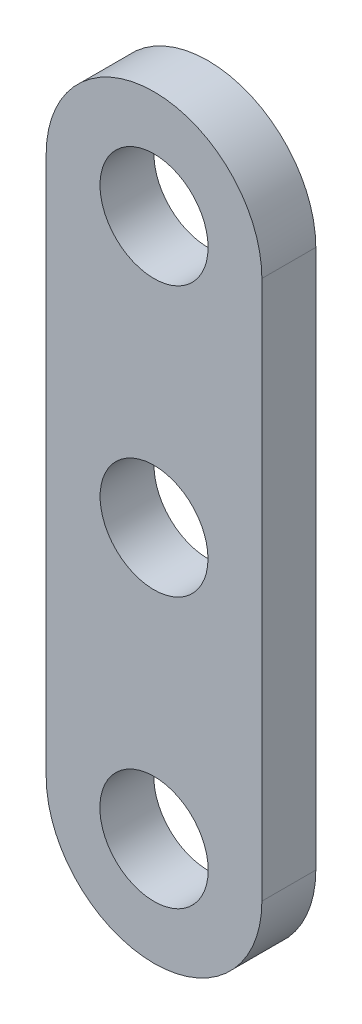
ISO-10303-21;
HEADER;
FILE_DESCRIPTION(('STEP AP214'),'2;1');
FILE_NAME('part.step','',(''),(''),'','','');
FILE_SCHEMA(('AUTOMOTIVE_DESIGN { 1 0 10303 214 1 1 1 1 }'));
ENDSEC;
DATA;
#1=APPLICATION_CONTEXT('core data for automotive mechanical design processes');
#2=APPLICATION_PROTOCOL_DEFINITION('international standard','automotive_design',2000,#1);
#3=PRODUCT_CONTEXT('',#1,'mechanical');
#4=PRODUCT('Part','Part','',(#3));
#5=PRODUCT_RELATED_PRODUCT_CATEGORY('part','',(#4));
#6=PRODUCT_DEFINITION_FORMATION('','',#4);
#7=PRODUCT_DEFINITION_CONTEXT('part definition',#1,'design');
#8=PRODUCT_DEFINITION('design','',#6,#7);
#9=PRODUCT_DEFINITION_SHAPE('','',#8);
#10=(LENGTH_UNIT() NAMED_UNIT(*) SI_UNIT(.MILLI.,.METRE.));
#11=(NAMED_UNIT(*) PLANE_ANGLE_UNIT() SI_UNIT($,.RADIAN.));
#12=(NAMED_UNIT(*) SI_UNIT($,.STERADIAN.) SOLID_ANGLE_UNIT());
#13=UNCERTAINTY_MEASURE_WITH_UNIT(LENGTH_MEASURE(1.E-05),#10,'distance_accuracy_value','');
#14=(GEOMETRIC_REPRESENTATION_CONTEXT(3) GLOBAL_UNCERTAINTY_ASSIGNED_CONTEXT((#13)) GLOBAL_UNIT_ASSIGNED_CONTEXT((#10,
#11,#12)) REPRESENTATION_CONTEXT('',''));
#15=CARTESIAN_POINT('',(0.,0.,0.));
#16=DIRECTION('',(0.,0.,1.));
#17=DIRECTION('',(1.,0.,0.));
#18=AXIS2_PLACEMENT_3D('',#15,#16,#17);
#19=CARTESIAN_POINT('',(0.,0.,3.));
#20=DIRECTION('',(0.,0.,1.));
#21=DIRECTION('',(1.,0.,0.));
#22=AXIS2_PLACEMENT_3D('',#19,#20,#21);
#23=PLANE('',#22);
#24=CARTESIAN_POINT('',(0.,-30.,3.));
#25=DIRECTION('',(0.,0.,1.));
#26=DIRECTION('',(1.,0.,0.));
#27=AXIS2_PLACEMENT_3D('',#24,#25,#26);
#28=CIRCLE('',#27,3.01397284489997);
#29=CARTESIAN_POINT('',(3.01397284489997,-30.,3.));
#30=VERTEX_POINT('',#29);
#31=EDGE_CURVE('E121',#30,#30,#28,.T.);
#32=ORIENTED_EDGE('',*,*,#31,.F.);
#33=EDGE_LOOP('',(#32));
#34=FACE_BOUND('',#33,.T.);
#35=CARTESIAN_POINT('',(0.,0.,3.));
#36=DIRECTION('',(0.,0.,1.));
#37=DIRECTION('',(1.,0.,0.));
#38=AXIS2_PLACEMENT_3D('',#35,#36,#37);
#39=CIRCLE('',#38,6.);
#40=CARTESIAN_POINT('',(6.,0.,3.));
#41=VERTEX_POINT('',#40);
#42=CARTESIAN_POINT('',(-6.,0.,3.));
#43=VERTEX_POINT('',#42);
#44=EDGE_CURVE('E91',#41,#43,#39,.T.);
#45=ORIENTED_EDGE('',*,*,#44,.T.);
#46=DIRECTION('',(0.,-1.,0.));
#47=VECTOR('',#46,1.);
#48=CARTESIAN_POINT('',(-6.,0.,3.));
#49=LINE('',#48,#47);
#50=CARTESIAN_POINT('',(-5.99999999999999,-30.,3.));
#51=VERTEX_POINT('',#50);
#52=EDGE_CURVE('E86',#43,#51,#49,.T.);
#53=ORIENTED_EDGE('',*,*,#52,.T.);
#54=CARTESIAN_POINT('',(0.,-30.,3.));
#55=DIRECTION('',(0.,0.,1.));
#56=DIRECTION('',(1.,0.,0.));
#57=AXIS2_PLACEMENT_3D('',#54,#55,#56);
#58=CIRCLE('',#57,6.);
#59=CARTESIAN_POINT('',(6.,-30.,3.));
#60=VERTEX_POINT('',#59);
#61=EDGE_CURVE('E89',#51,#60,#58,.T.);
#62=ORIENTED_EDGE('',*,*,#61,.T.);
#63=DIRECTION('',(0.,1.,0.));
#64=VECTOR('',#63,1.);
#65=CARTESIAN_POINT('',(6.,0.,3.));
#66=LINE('',#65,#64);
#67=EDGE_CURVE('E56',#60,#41,#66,.T.);
#68=ORIENTED_EDGE('',*,*,#67,.T.);
#69=EDGE_LOOP('',(#45,#53,#62,#68));
#70=FACE_BOUND('',#69,.T.);
#71=CARTESIAN_POINT('',(0.,0.,3.));
#72=DIRECTION('',(0.,0.,1.));
#73=DIRECTION('',(1.,0.,0.));
#74=AXIS2_PLACEMENT_3D('',#71,#72,#73);
#75=CIRCLE('',#74,3.00606813744803);
#76=CARTESIAN_POINT('',(3.00606813744803,0.,3.));
#77=VERTEX_POINT('',#76);
#78=EDGE_CURVE('E106',#77,#77,#75,.T.);
#79=ORIENTED_EDGE('',*,*,#78,.F.);
#80=EDGE_LOOP('',(#79));
#81=FACE_BOUND('',#80,.T.);
#82=CARTESIAN_POINT('',(0.,-15.,3.));
#83=DIRECTION('',(0.,0.,1.));
#84=DIRECTION('',(1.,0.,0.));
#85=AXIS2_PLACEMENT_3D('',#82,#83,#84);
#86=CIRCLE('',#85,3.00091393736871);
#87=CARTESIAN_POINT('',(3.00091393736871,-15.,3.));
#88=VERTEX_POINT('',#87);
#89=EDGE_CURVE('E127',#88,#88,#86,.T.);
#90=ORIENTED_EDGE('',*,*,#89,.F.);
#91=EDGE_LOOP('',(#90));
#92=FACE_BOUND('',#91,.T.);
#93=ADVANCED_FACE('F39',(#34,#70,#81,#92),#23,.T.);
#94=CARTESIAN_POINT('',(0.,0.,0.));
#95=DIRECTION('',(0.,0.,1.));
#96=DIRECTION('',(1.,0.,0.));
#97=AXIS2_PLACEMENT_3D('',#94,#95,#96);
#98=PLANE('',#97);
#99=CARTESIAN_POINT('',(0.,0.,0.));
#100=DIRECTION('',(0.,0.,1.));
#101=DIRECTION('',(1.,0.,0.));
#102=AXIS2_PLACEMENT_3D('',#99,#100,#101);
#103=CIRCLE('',#102,6.);
#104=CARTESIAN_POINT('',(6.,0.,0.));
#105=VERTEX_POINT('',#104);
#106=CARTESIAN_POINT('',(-6.,0.,0.));
#107=VERTEX_POINT('',#106);
#108=EDGE_CURVE('E103',#105,#107,#103,.T.);
#109=ORIENTED_EDGE('',*,*,#108,.F.);
#110=DIRECTION('',(0.,1.,0.));
#111=VECTOR('',#110,1.);
#112=CARTESIAN_POINT('',(6.,0.,0.));
#113=LINE('',#112,#111);
#114=CARTESIAN_POINT('',(6.,-30.,0.));
#115=VERTEX_POINT('',#114);
#116=EDGE_CURVE('E79',#115,#105,#113,.T.);
#117=ORIENTED_EDGE('',*,*,#116,.F.);
#118=CARTESIAN_POINT('',(0.,-30.,0.));
#119=DIRECTION('',(0.,0.,1.));
#120=DIRECTION('',(1.,0.,0.));
#121=AXIS2_PLACEMENT_3D('',#118,#119,#120);
#122=CIRCLE('',#121,6.);
#123=CARTESIAN_POINT('',(-5.99999999999999,-30.,0.));
#124=VERTEX_POINT('',#123);
#125=EDGE_CURVE('E73',#124,#115,#122,.T.);
#126=ORIENTED_EDGE('',*,*,#125,.F.);
#127=DIRECTION('',(0.,-1.,0.));
#128=VECTOR('',#127,1.);
#129=CARTESIAN_POINT('',(-6.,0.,0.));
#130=LINE('',#129,#128);
#131=EDGE_CURVE('E95',#107,#124,#130,.T.);
#132=ORIENTED_EDGE('',*,*,#131,.F.);
#133=EDGE_LOOP('',(#109,#117,#126,#132));
#134=FACE_BOUND('',#133,.T.);
#135=CARTESIAN_POINT('',(0.,0.,0.));
#136=DIRECTION('',(0.,0.,1.));
#137=DIRECTION('',(1.,0.,0.));
#138=AXIS2_PLACEMENT_3D('',#135,#136,#137);
#139=CIRCLE('',#138,3.00606813744803);
#140=CARTESIAN_POINT('',(3.00606813744803,0.,0.));
#141=VERTEX_POINT('',#140);
#142=EDGE_CURVE('E118',#141,#141,#139,.T.);
#143=ORIENTED_EDGE('',*,*,#142,.T.);
#144=EDGE_LOOP('',(#143));
#145=FACE_BOUND('',#144,.T.);
#146=CARTESIAN_POINT('',(0.,-30.,0.));
#147=DIRECTION('',(0.,0.,1.));
#148=DIRECTION('',(1.,0.,0.));
#149=AXIS2_PLACEMENT_3D('',#146,#147,#148);
#150=CIRCLE('',#149,3.01397284489997);
#151=CARTESIAN_POINT('',(3.01397284489997,-30.,0.));
#152=VERTEX_POINT('',#151);
#153=EDGE_CURVE('E124',#152,#152,#150,.T.);
#154=ORIENTED_EDGE('',*,*,#153,.T.);
#155=EDGE_LOOP('',(#154));
#156=FACE_BOUND('',#155,.T.);
#157=CARTESIAN_POINT('',(0.,-15.,0.));
#158=DIRECTION('',(0.,0.,1.));
#159=DIRECTION('',(1.,0.,0.));
#160=AXIS2_PLACEMENT_3D('',#157,#158,#159);
#161=CIRCLE('',#160,3.00091393736871);
#162=CARTESIAN_POINT('',(3.00091393736871,-15.,0.));
#163=VERTEX_POINT('',#162);
#164=EDGE_CURVE('E130',#163,#163,#161,.T.);
#165=ORIENTED_EDGE('',*,*,#164,.T.);
#166=EDGE_LOOP('',(#165));
#167=FACE_BOUND('',#166,.T.);
#168=ADVANCED_FACE('F114',(#134,#145,#156,#167),#98,.F.);
#169=CARTESIAN_POINT('',(0.,0.,3.));
#170=DIRECTION('',(0.,0.,-1.));
#171=DIRECTION('',(-1.,0.,0.));
#172=AXIS2_PLACEMENT_3D('',#169,#170,#171);
#173=CYLINDRICAL_SURFACE('',#172,6.);
#174=ORIENTED_EDGE('',*,*,#108,.T.);
#175=DIRECTION('',(0.,0.,-1.));
#176=VECTOR('',#175,1.);
#177=CARTESIAN_POINT('',(-6.,0.,3.));
#178=LINE('',#177,#176);
#179=EDGE_CURVE('E11',#43,#107,#178,.T.);
#180=ORIENTED_EDGE('',*,*,#179,.F.);
#181=ORIENTED_EDGE('',*,*,#44,.F.);
#182=DIRECTION('',(0.,0.,-1.));
#183=VECTOR('',#182,1.);
#184=CARTESIAN_POINT('',(6.,0.,3.));
#185=LINE('',#184,#183);
#186=EDGE_CURVE('E99',#41,#105,#185,.T.);
#187=ORIENTED_EDGE('',*,*,#186,.T.);
#188=EDGE_LOOP('',(#174,#180,#181,#187));
#189=FACE_BOUND('',#188,.T.);
#190=ADVANCED_FACE('F41',(#189),#173,.T.);
#191=CARTESIAN_POINT('',(-6.,0.,3.));
#192=DIRECTION('',(1.,0.,0.));
#193=DIRECTION('',(0.,1.,0.));
#194=AXIS2_PLACEMENT_3D('',#191,#192,#193);
#195=PLANE('',#194);
#196=ORIENTED_EDGE('',*,*,#131,.T.);
#197=DIRECTION('',(0.,0.,-1.));
#198=VECTOR('',#197,1.);
#199=CARTESIAN_POINT('',(-5.99999999999999,-30.,3.));
#200=LINE('',#199,#198);
#201=EDGE_CURVE('E48',#51,#124,#200,.T.);
#202=ORIENTED_EDGE('',*,*,#201,.F.);
#203=ORIENTED_EDGE('',*,*,#52,.F.);
#204=ORIENTED_EDGE('',*,*,#179,.T.);
#205=EDGE_LOOP('',(#196,#202,#203,#204));
#206=FACE_BOUND('',#205,.T.);
#207=ADVANCED_FACE('F94',(#206),#195,.F.);
#208=CARTESIAN_POINT('',(0.,-30.,3.));
#209=DIRECTION('',(0.,0.,-1.));
#210=DIRECTION('',(-1.,0.,0.));
#211=AXIS2_PLACEMENT_3D('',#208,#209,#210);
#212=CYLINDRICAL_SURFACE('',#211,6.);
#213=ORIENTED_EDGE('',*,*,#125,.T.);
#214=DIRECTION('',(0.,0.,-1.));
#215=VECTOR('',#214,1.);
#216=CARTESIAN_POINT('',(6.,-30.,3.));
#217=LINE('',#216,#215);
#218=EDGE_CURVE('E96',#60,#115,#217,.T.);
#219=ORIENTED_EDGE('',*,*,#218,.F.);
#220=ORIENTED_EDGE('',*,*,#61,.F.);
#221=ORIENTED_EDGE('',*,*,#201,.T.);
#222=EDGE_LOOP('',(#213,#219,#220,#221));
#223=FACE_BOUND('',#222,.T.);
#224=ADVANCED_FACE('F97',(#223),#212,.T.);
#225=CARTESIAN_POINT('',(6.,0.,3.));
#226=DIRECTION('',(-1.,0.,0.));
#227=DIRECTION('',(0.,-1.,0.));
#228=AXIS2_PLACEMENT_3D('',#225,#226,#227);
#229=PLANE('',#228);
#230=ORIENTED_EDGE('',*,*,#116,.T.);
#231=ORIENTED_EDGE('',*,*,#186,.F.);
#232=ORIENTED_EDGE('',*,*,#67,.F.);
#233=ORIENTED_EDGE('',*,*,#218,.T.);
#234=EDGE_LOOP('',(#230,#231,#232,#233));
#235=FACE_BOUND('',#234,.T.);
#236=ADVANCED_FACE('F111',(#235),#229,.F.);
#237=CARTESIAN_POINT('',(0.,0.,3.));
#238=DIRECTION('',(0.,0.,-1.));
#239=DIRECTION('',(-1.,0.,0.));
#240=AXIS2_PLACEMENT_3D('',#237,#238,#239);
#241=CYLINDRICAL_SURFACE('',#240,3.00606813744803);
#242=ORIENTED_EDGE('',*,*,#78,.T.);
#243=EDGE_LOOP('',(#242));
#244=FACE_BOUND('',#243,.T.);
#245=ORIENTED_EDGE('',*,*,#142,.F.);
#246=EDGE_LOOP('',(#245));
#247=FACE_BOUND('',#246,.T.);
#248=ADVANCED_FACE('F148',(#244,#247),#241,.F.);
#249=CARTESIAN_POINT('',(0.,-30.,3.));
#250=DIRECTION('',(0.,0.,-1.));
#251=DIRECTION('',(-1.,0.,0.));
#252=AXIS2_PLACEMENT_3D('',#249,#250,#251);
#253=CYLINDRICAL_SURFACE('',#252,3.01397284489997);
#254=ORIENTED_EDGE('',*,*,#31,.T.);
#255=EDGE_LOOP('',(#254));
#256=FACE_BOUND('',#255,.T.);
#257=ORIENTED_EDGE('',*,*,#153,.F.);
#258=EDGE_LOOP('',(#257));
#259=FACE_BOUND('',#258,.T.);
#260=ADVANCED_FACE('F193',(#256,#259),#253,.F.);
#261=CARTESIAN_POINT('',(0.,-15.,3.));
#262=DIRECTION('',(0.,0.,-1.));
#263=DIRECTION('',(-1.,0.,0.));
#264=AXIS2_PLACEMENT_3D('',#261,#262,#263);
#265=CYLINDRICAL_SURFACE('',#264,3.00091393736871);
#266=ORIENTED_EDGE('',*,*,#89,.T.);
#267=EDGE_LOOP('',(#266));
#268=FACE_BOUND('',#267,.T.);
#269=ORIENTED_EDGE('',*,*,#164,.F.);
#270=EDGE_LOOP('',(#269));
#271=FACE_BOUND('',#270,.T.);
#272=ADVANCED_FACE('F136',(#268,#271),#265,.F.);
#273=CLOSED_SHELL('',(#93,#168,#190,#207,#224,#236,#248,#260,#272));
#274=MANIFOLD_SOLID_BREP('B2',#273);
#275=ADVANCED_BREP_SHAPE_REPRESENTATION('',(#18,#274),#14);
#276=SHAPE_DEFINITION_REPRESENTATION(#9,#275);
ENDSEC;
END-ISO-10303-21;
